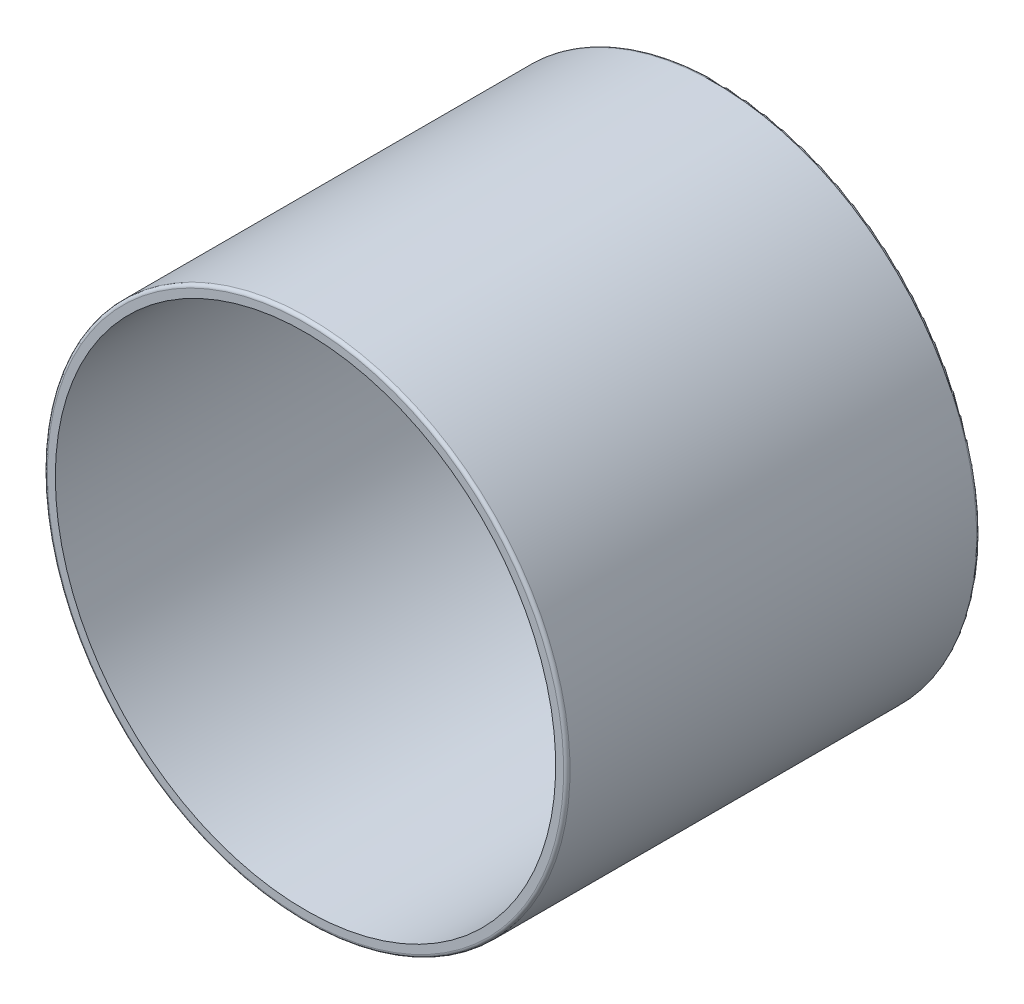
ISO-10303-21;
HEADER;
FILE_DESCRIPTION(('STEP AP214'),'2;1');
FILE_NAME('part.step','',(''),(''),'','','');
FILE_SCHEMA(('AUTOMOTIVE_DESIGN { 1 0 10303 214 1 1 1 1 }'));
ENDSEC;
DATA;
#1=APPLICATION_CONTEXT('core data for automotive mechanical design processes');
#2=APPLICATION_PROTOCOL_DEFINITION('international standard','automotive_design',2000,#1);
#3=PRODUCT_CONTEXT('',#1,'mechanical');
#4=PRODUCT('Part','Part','',(#3));
#5=PRODUCT_RELATED_PRODUCT_CATEGORY('part','',(#4));
#6=PRODUCT_DEFINITION_FORMATION('','',#4);
#7=PRODUCT_DEFINITION_CONTEXT('part definition',#1,'design');
#8=PRODUCT_DEFINITION('design','',#6,#7);
#9=PRODUCT_DEFINITION_SHAPE('','',#8);
#10=(LENGTH_UNIT() NAMED_UNIT(*) SI_UNIT(.MILLI.,.METRE.));
#11=(NAMED_UNIT(*) PLANE_ANGLE_UNIT() SI_UNIT($,.RADIAN.));
#12=(NAMED_UNIT(*) SI_UNIT($,.STERADIAN.) SOLID_ANGLE_UNIT());
#13=UNCERTAINTY_MEASURE_WITH_UNIT(LENGTH_MEASURE(1.E-05),#10,'distance_accuracy_value','');
#14=(GEOMETRIC_REPRESENTATION_CONTEXT(3) GLOBAL_UNCERTAINTY_ASSIGNED_CONTEXT((#13)) GLOBAL_UNIT_ASSIGNED_CONTEXT((#10,
#11,#12)) REPRESENTATION_CONTEXT('',''));
#15=CARTESIAN_POINT('',(0.,0.,0.));
#16=DIRECTION('',(0.,0.,1.));
#17=DIRECTION('',(1.,0.,0.));
#18=AXIS2_PLACEMENT_3D('',#15,#16,#17);
#19=CARTESIAN_POINT('',(0.,0.,0.254));
#20=DIRECTION('',(0.,0.,1.));
#21=DIRECTION('',(1.,0.,0.));
#22=AXIS2_PLACEMENT_3D('',#19,#20,#21);
#23=TOROIDAL_SURFACE('',#22,20.5613,0.254);
#24=CARTESIAN_POINT('',(0.,0.,0.));
#25=DIRECTION('',(0.,0.,-1.));
#26=DIRECTION('',(1.,0.,0.));
#27=AXIS2_PLACEMENT_3D('',#24,#25,#26);
#28=CIRCLE('',#27,20.5613);
#29=CARTESIAN_POINT('',(20.5613,0.,0.));
#30=VERTEX_POINT('',#29);
#31=EDGE_CURVE('E56',#30,#30,#28,.T.);
#32=ORIENTED_EDGE('',*,*,#31,.F.);
#33=EDGE_LOOP('',(#32));
#34=FACE_BOUND('',#33,.T.);
#35=CARTESIAN_POINT('',(0.,0.,0.254));
#36=DIRECTION('',(0.,0.,1.));
#37=DIRECTION('',(1.,0.,0.));
#38=AXIS2_PLACEMENT_3D('',#35,#36,#37);
#39=CIRCLE('',#38,20.8153);
#40=CARTESIAN_POINT('',(20.8153,0.,0.254));
#41=VERTEX_POINT('',#40);
#42=EDGE_CURVE('E63',#41,#41,#39,.T.);
#43=ORIENTED_EDGE('',*,*,#42,.F.);
#44=EDGE_LOOP('',(#43));
#45=FACE_BOUND('',#44,.T.);
#46=ADVANCED_FACE('F17',(#34,#45),#23,.T.);
#47=CARTESIAN_POINT('',(0.,0.,32.639));
#48=DIRECTION('',(0.,0.,-1.));
#49=DIRECTION('',(-1.,0.,0.));
#50=AXIS2_PLACEMENT_3D('',#47,#48,#49);
#51=TOROIDAL_SURFACE('',#50,20.5613,0.254);
#52=CARTESIAN_POINT('',(0.,0.,32.639));
#53=DIRECTION('',(0.,0.,-1.));
#54=DIRECTION('',(-1.,0.,0.));
#55=AXIS2_PLACEMENT_3D('',#52,#53,#54);
#56=CIRCLE('',#55,20.8153);
#57=CARTESIAN_POINT('',(-20.8153,0.,32.639));
#58=VERTEX_POINT('',#57);
#59=EDGE_CURVE('E68',#58,#58,#56,.T.);
#60=ORIENTED_EDGE('',*,*,#59,.F.);
#61=EDGE_LOOP('',(#60));
#62=FACE_BOUND('',#61,.T.);
#63=CARTESIAN_POINT('',(0.,0.,32.893));
#64=DIRECTION('',(0.,0.,1.));
#65=DIRECTION('',(-1.,0.,0.));
#66=AXIS2_PLACEMENT_3D('',#63,#64,#65);
#67=CIRCLE('',#66,20.5613);
#68=CARTESIAN_POINT('',(-20.5613,0.,32.893));
#69=VERTEX_POINT('',#68);
#70=EDGE_CURVE('E11',#69,#69,#67,.T.);
#71=ORIENTED_EDGE('',*,*,#70,.F.);
#72=EDGE_LOOP('',(#71));
#73=FACE_BOUND('',#72,.T.);
#74=ADVANCED_FACE('F100',(#62,#73),#51,.T.);
#75=CARTESIAN_POINT('',(-19.9263,0.,32.893));
#76=DIRECTION('',(0.,0.,-1.));
#77=DIRECTION('',(0.,-1.,0.));
#78=AXIS2_PLACEMENT_3D('',#75,#76,#77);
#79=PLANE('',#78);
#80=CARTESIAN_POINT('',(0.,0.,32.893));
#81=DIRECTION('',(0.,0.,-1.));
#82=DIRECTION('',(-1.,0.,0.));
#83=AXIS2_PLACEMENT_3D('',#80,#81,#82);
#84=CIRCLE('',#83,19.9263);
#85=CARTESIAN_POINT('',(-19.9263,0.,32.893));
#86=VERTEX_POINT('',#85);
#87=EDGE_CURVE('E26',#86,#86,#84,.T.);
#88=ORIENTED_EDGE('',*,*,#87,.T.);
#89=EDGE_LOOP('',(#88));
#90=FACE_BOUND('',#89,.T.);
#91=ORIENTED_EDGE('',*,*,#70,.T.);
#92=EDGE_LOOP('',(#91));
#93=FACE_BOUND('',#92,.T.);
#94=ADVANCED_FACE('F97',(#90,#93),#79,.F.);
#95=CARTESIAN_POINT('',(0.,0.,0.));
#96=DIRECTION('',(0.,0.,-1.));
#97=DIRECTION('',(-1.,0.,0.));
#98=AXIS2_PLACEMENT_3D('',#95,#96,#97);
#99=CYLINDRICAL_SURFACE('',#98,19.9263);
#100=CARTESIAN_POINT('',(0.,0.,0.));
#101=DIRECTION('',(0.,0.,-1.));
#102=DIRECTION('',(-1.,0.,0.));
#103=AXIS2_PLACEMENT_3D('',#100,#101,#102);
#104=CIRCLE('',#103,19.9263);
#105=CARTESIAN_POINT('',(-19.9263,0.,0.));
#106=VERTEX_POINT('',#105);
#107=EDGE_CURVE('E74',#106,#106,#104,.T.);
#108=ORIENTED_EDGE('',*,*,#107,.T.);
#109=EDGE_LOOP('',(#108));
#110=FACE_BOUND('',#109,.T.);
#111=ORIENTED_EDGE('',*,*,#87,.F.);
#112=EDGE_LOOP('',(#111));
#113=FACE_BOUND('',#112,.T.);
#114=ADVANCED_FACE('F19',(#110,#113),#99,.F.);
#115=CARTESIAN_POINT('',(-20.8153,0.,0.));
#116=DIRECTION('',(0.,0.,1.));
#117=DIRECTION('',(1.,0.,0.));
#118=AXIS2_PLACEMENT_3D('',#115,#116,#117);
#119=PLANE('',#118);
#120=ORIENTED_EDGE('',*,*,#107,.F.);
#121=EDGE_LOOP('',(#120));
#122=FACE_BOUND('',#121,.T.);
#123=ORIENTED_EDGE('',*,*,#31,.T.);
#124=EDGE_LOOP('',(#123));
#125=FACE_BOUND('',#124,.T.);
#126=ADVANCED_FACE('F87',(#122,#125),#119,.F.);
#127=CARTESIAN_POINT('',(0.,0.,0.));
#128=DIRECTION('',(0.,0.,-1.));
#129=DIRECTION('',(-1.,0.,0.));
#130=AXIS2_PLACEMENT_3D('',#127,#128,#129);
#131=CYLINDRICAL_SURFACE('',#130,20.8153);
#132=ORIENTED_EDGE('',*,*,#42,.T.);
#133=EDGE_LOOP('',(#132));
#134=FACE_BOUND('',#133,.T.);
#135=ORIENTED_EDGE('',*,*,#59,.T.);
#136=EDGE_LOOP('',(#135));
#137=FACE_BOUND('',#136,.T.);
#138=ADVANCED_FACE('F64',(#134,#137),#131,.T.);
#139=CLOSED_SHELL('',(#46,#74,#94,#114,#126,#138));
#140=MANIFOLD_SOLID_BREP('B1',#139);
#141=ADVANCED_BREP_SHAPE_REPRESENTATION('',(#18,#140),#14);
#142=SHAPE_DEFINITION_REPRESENTATION(#9,#141);
ENDSEC;
END-ISO-10303-21;
